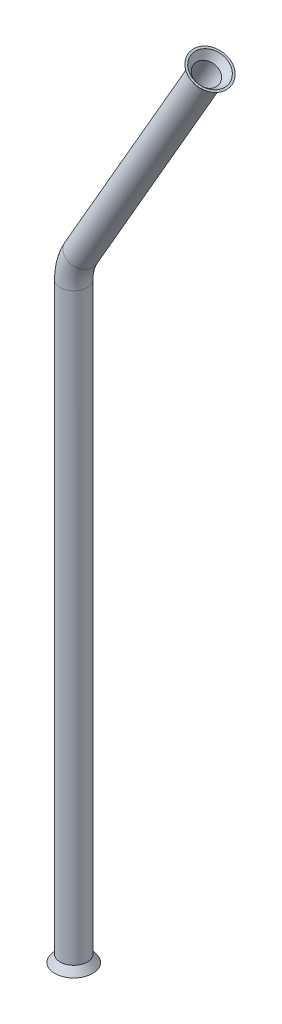
ISO-10303-21;
HEADER;
FILE_DESCRIPTION(('STEP AP214'),'2;1');
FILE_NAME('part.step','',(''),(''),'','','');
FILE_SCHEMA(('AUTOMOTIVE_DESIGN { 1 0 10303 214 1 1 1 1 }'));
ENDSEC;
DATA;
#1=APPLICATION_CONTEXT('core data for automotive mechanical design processes');
#2=APPLICATION_PROTOCOL_DEFINITION('international standard','automotive_design',2000,#1);
#3=PRODUCT_CONTEXT('',#1,'mechanical');
#4=PRODUCT('Part','Part','',(#3));
#5=PRODUCT_RELATED_PRODUCT_CATEGORY('part','',(#4));
#6=PRODUCT_DEFINITION_FORMATION('','',#4);
#7=PRODUCT_DEFINITION_CONTEXT('part definition',#1,'design');
#8=PRODUCT_DEFINITION('design','',#6,#7);
#9=PRODUCT_DEFINITION_SHAPE('','',#8);
#10=(LENGTH_UNIT() NAMED_UNIT(*) SI_UNIT(.MILLI.,.METRE.));
#11=(NAMED_UNIT(*) PLANE_ANGLE_UNIT() SI_UNIT($,.RADIAN.));
#12=(NAMED_UNIT(*) SI_UNIT($,.STERADIAN.) SOLID_ANGLE_UNIT());
#13=UNCERTAINTY_MEASURE_WITH_UNIT(LENGTH_MEASURE(1.E-05),#10,'distance_accuracy_value','');
#14=(GEOMETRIC_REPRESENTATION_CONTEXT(3) GLOBAL_UNCERTAINTY_ASSIGNED_CONTEXT((#13)) GLOBAL_UNIT_ASSIGNED_CONTEXT((#10,
#11,#12)) REPRESENTATION_CONTEXT('',''));
#15=CARTESIAN_POINT('',(0.,0.,0.));
#16=DIRECTION('',(0.,0.,1.));
#17=DIRECTION('',(1.,0.,0.));
#18=AXIS2_PLACEMENT_3D('',#15,#16,#17);
#19=CARTESIAN_POINT('',(0.,0.,0.));
#20=DIRECTION('',(0.,1.,0.));
#21=DIRECTION('',(0.,0.,1.));
#22=AXIS2_PLACEMENT_3D('',#19,#20,#21);
#23=CYLINDRICAL_SURFACE('',#22,4.826);
#24=CARTESIAN_POINT('',(0.,206.956941603564,0.));
#25=DIRECTION('',(0.,1.,0.));
#26=DIRECTION('',(0.,0.,1.));
#27=AXIS2_PLACEMENT_3D('',#24,#25,#26);
#28=CIRCLE('',#27,4.826);
#29=CARTESIAN_POINT('',(-4.82599999999996,206.956941603564,0.));
#30=VERTEX_POINT('',#29);
#31=EDGE_CURVE('E51',#30,#30,#28,.T.);
#32=ORIENTED_EDGE('',*,*,#31,.F.);
#33=EDGE_LOOP('',(#32));
#34=FACE_BOUND('',#33,.T.);
#35=CARTESIAN_POINT('',(0.,0.,0.));
#36=DIRECTION('',(0.,-1.,0.));
#37=DIRECTION('',(0.,0.,-1.));
#38=AXIS2_PLACEMENT_3D('',#35,#36,#37);
#39=CIRCLE('',#38,4.826);
#40=CARTESIAN_POINT('',(0.,0.,-4.826));
#41=VERTEX_POINT('',#40);
#42=EDGE_CURVE('E58',#41,#41,#39,.T.);
#43=ORIENTED_EDGE('',*,*,#42,.F.);
#44=EDGE_LOOP('',(#43));
#45=FACE_BOUND('',#44,.T.);
#46=ADVANCED_FACE('F33',(#34,#45),#23,.T.);
#47=CARTESIAN_POINT('',(19.0500000000001,206.956941603564,0.));
#48=DIRECTION('',(0.,0.,-1.));
#49=DIRECTION('',(-1.,0.,0.));
#50=AXIS2_PLACEMENT_3D('',#47,#48,#49);
#51=TOROIDAL_SURFACE('',#50,19.05,4.826);
#52=CARTESIAN_POINT('',(2.5522160579065,216.481941603564,0.));
#53=DIRECTION('',(0.500000000000001,0.866025403784438,0.));
#54=DIRECTION('',(0.,0.,1.));
#55=AXIS2_PLACEMENT_3D('',#52,#53,#54);
#56=CIRCLE('',#55,4.826);
#57=CARTESIAN_POINT('',(-1.6272225407572,218.894941603564,0.));
#58=VERTEX_POINT('',#57);
#59=EDGE_CURVE('E37',#58,#58,#56,.T.);
#60=CARTESIAN_POINT('',(19.0500000000001,206.956941603564,0.));
#61=DIRECTION('',(0.,0.,-1.));
#62=DIRECTION('',(-1.,0.,0.));
#63=AXIS2_PLACEMENT_3D('',#60,#61,#62);
#64=CIRCLE('',#63,23.876);
#65=EDGE_CURVE('',#30,#58,#64,.T.);
#66=ORIENTED_EDGE('',*,*,#31,.T.);
#67=ORIENTED_EDGE('',*,*,#59,.F.);
#68=ORIENTED_EDGE('',*,*,#65,.T.);
#69=ORIENTED_EDGE('',*,*,#65,.F.);
#70=EDGE_LOOP('',(#66,#68,#67,#69));
#71=FACE_BOUND('',#70,.T.);
#72=ADVANCED_FACE('F99',(#71),#51,.T.);
#73=CARTESIAN_POINT('',(2.55221605790653,216.481941603564,0.));
#74=DIRECTION('',(0.500000000000001,0.866025403784438,0.));
#75=DIRECTION('',(-0.866025403784438,0.500000000000001,0.));
#76=AXIS2_PLACEMENT_3D('',#73,#74,#75);
#77=CYLINDRICAL_SURFACE('',#76,4.826);
#78=CARTESIAN_POINT('',(47.0022160579065,293.4716,0.));
#79=DIRECTION('',(0.500000000000001,0.866025403784438,0.));
#80=DIRECTION('',(0.,0.,1.));
#81=AXIS2_PLACEMENT_3D('',#78,#79,#80);
#82=CIRCLE('',#81,4.826);
#83=CARTESIAN_POINT('',(47.0022160579065,293.4716,4.826));
#84=VERTEX_POINT('',#83);
#85=EDGE_CURVE('E46',#84,#84,#82,.T.);
#86=ORIENTED_EDGE('',*,*,#85,.F.);
#87=EDGE_LOOP('',(#86));
#88=FACE_BOUND('',#87,.T.);
#89=ORIENTED_EDGE('',*,*,#59,.T.);
#90=EDGE_LOOP('',(#89));
#91=FACE_BOUND('',#90,.T.);
#92=ADVANCED_FACE('F35',(#88,#91),#77,.T.);
#93=CARTESIAN_POINT('',(0.,0.,0.));
#94=DIRECTION('',(0.,1.,0.));
#95=DIRECTION('',(0.,0.,1.));
#96=AXIS2_PLACEMENT_3D('',#93,#94,#95);
#97=CYLINDRICAL_SURFACE('',#96,4.064);
#98=CARTESIAN_POINT('',(0.,206.956941603564,0.));
#99=DIRECTION('',(0.,1.,0.));
#100=DIRECTION('',(0.,0.,1.));
#101=AXIS2_PLACEMENT_3D('',#98,#99,#100);
#102=CIRCLE('',#101,4.064);
#103=CARTESIAN_POINT('',(-4.06399999999996,206.956941603564,0.));
#104=VERTEX_POINT('',#103);
#105=EDGE_CURVE('E41',#104,#104,#102,.F.);
#106=ORIENTED_EDGE('',*,*,#105,.F.);
#107=EDGE_LOOP('',(#106));
#108=FACE_BOUND('',#107,.T.);
#109=CARTESIAN_POINT('',(0.,0.,0.));
#110=DIRECTION('',(0.,-1.,0.));
#111=DIRECTION('',(0.,0.,-1.));
#112=AXIS2_PLACEMENT_3D('',#109,#110,#111);
#113=CIRCLE('',#112,4.064);
#114=CARTESIAN_POINT('',(0.,0.,-4.064));
#115=VERTEX_POINT('',#114);
#116=EDGE_CURVE('E62',#115,#115,#113,.T.);
#117=ORIENTED_EDGE('',*,*,#116,.T.);
#118=EDGE_LOOP('',(#117));
#119=FACE_BOUND('',#118,.T.);
#120=ADVANCED_FACE('F98',(#108,#119),#97,.F.);
#121=CARTESIAN_POINT('',(19.0500000000001,206.956941603564,0.));
#122=DIRECTION('',(0.,0.,-1.));
#123=DIRECTION('',(-1.,0.,0.));
#124=AXIS2_PLACEMENT_3D('',#121,#122,#123);
#125=TOROIDAL_SURFACE('',#124,19.05,4.064);
#126=CARTESIAN_POINT('',(2.5522160579065,216.481941603564,0.));
#127=DIRECTION('',(0.500000000000001,0.866025403784438,0.));
#128=DIRECTION('',(0.,0.,1.));
#129=AXIS2_PLACEMENT_3D('',#126,#127,#128);
#130=CIRCLE('',#129,4.064);
#131=CARTESIAN_POINT('',(-0.967311183073461,218.513941603564,0.));
#132=VERTEX_POINT('',#131);
#133=EDGE_CURVE('E10',#132,#132,#130,.F.);
#134=CARTESIAN_POINT('',(19.0500000000001,206.956941603564,0.));
#135=DIRECTION('',(0.,0.,-1.));
#136=DIRECTION('',(-1.,0.,0.));
#137=AXIS2_PLACEMENT_3D('',#134,#135,#136);
#138=CIRCLE('',#137,23.114);
#139=EDGE_CURVE('',#104,#132,#138,.T.);
#140=ORIENTED_EDGE('',*,*,#105,.T.);
#141=ORIENTED_EDGE('',*,*,#133,.F.);
#142=ORIENTED_EDGE('',*,*,#139,.T.);
#143=ORIENTED_EDGE('',*,*,#139,.F.);
#144=EDGE_LOOP('',(#140,#142,#141,#143));
#145=FACE_BOUND('',#144,.T.);
#146=ADVANCED_FACE('F111',(#145),#125,.F.);
#147=CARTESIAN_POINT('',(2.55221605790653,216.481941603564,0.));
#148=DIRECTION('',(0.500000000000001,0.866025403784438,0.));
#149=DIRECTION('',(-0.866025403784438,0.500000000000001,0.));
#150=AXIS2_PLACEMENT_3D('',#147,#148,#149);
#151=CYLINDRICAL_SURFACE('',#150,4.064);
#152=CARTESIAN_POINT('',(47.0022160579064,293.4716,0.));
#153=DIRECTION('',(0.500000000000001,0.866025403784438,0.));
#154=DIRECTION('',(-0.866025403784438,0.500000000000001,0.));
#155=AXIS2_PLACEMENT_3D('',#152,#153,#154);
#156=CIRCLE('',#155,4.06399999999984);
#157=CARTESIAN_POINT('',(43.4826888169266,295.5036,0.));
#158=VERTEX_POINT('',#157);
#159=EDGE_CURVE('E73',#158,#158,#156,.T.);
#160=ORIENTED_EDGE('',*,*,#159,.T.);
#161=EDGE_LOOP('',(#160));
#162=FACE_BOUND('',#161,.T.);
#163=ORIENTED_EDGE('',*,*,#133,.T.);
#164=EDGE_LOOP('',(#163));
#165=FACE_BOUND('',#164,.T.);
#166=ADVANCED_FACE('F109',(#162,#165),#151,.F.);
#167=CARTESIAN_POINT('',(0.,0.,0.));
#168=DIRECTION('',(0.,-1.,0.));
#169=DIRECTION('',(0.,0.,-1.));
#170=AXIS2_PLACEMENT_3D('',#167,#168,#169);
#171=CONICAL_SURFACE('',#170,4.826,0.645771823237903);
#172=CARTESIAN_POINT('',(0.,-2.54,0.));
#173=DIRECTION('',(0.,-1.,0.));
#174=DIRECTION('',(0.,0.,-1.));
#175=AXIS2_PLACEMENT_3D('',#172,#173,#174);
#176=CIRCLE('',#175,6.7400272872611);
#177=CARTESIAN_POINT('',(0.,-2.54,-6.7400272872611));
#178=VERTEX_POINT('',#177);
#179=EDGE_CURVE('E53',#178,#178,#176,.T.);
#180=ORIENTED_EDGE('',*,*,#179,.F.);
#181=EDGE_LOOP('',(#180));
#182=FACE_BOUND('',#181,.T.);
#183=ORIENTED_EDGE('',*,*,#42,.T.);
#184=EDGE_LOOP('',(#183));
#185=FACE_BOUND('',#184,.T.);
#186=ADVANCED_FACE('F108',(#182,#185),#171,.T.);
#187=CARTESIAN_POINT('',(0.,-2.54,0.));
#188=DIRECTION('',(0.,-1.,0.));
#189=DIRECTION('',(0.,0.,-1.));
#190=AXIS2_PLACEMENT_3D('',#187,#188,#189);
#191=PLANE('',#190);
#192=CARTESIAN_POINT('',(0.,-2.54,0.));
#193=DIRECTION('',(0.,-1.,0.));
#194=DIRECTION('',(0.,0.,-1.));
#195=AXIS2_PLACEMENT_3D('',#192,#193,#194);
#196=CIRCLE('',#195,5.9780272872611);
#197=CARTESIAN_POINT('',(0.,-2.54,-5.9780272872611));
#198=VERTEX_POINT('',#197);
#199=EDGE_CURVE('E67',#198,#198,#196,.T.);
#200=ORIENTED_EDGE('',*,*,#199,.F.);
#201=EDGE_LOOP('',(#200));
#202=FACE_BOUND('',#201,.T.);
#203=ORIENTED_EDGE('',*,*,#179,.T.);
#204=EDGE_LOOP('',(#203));
#205=FACE_BOUND('',#204,.T.);
#206=ADVANCED_FACE('F118',(#202,#205),#191,.T.);
#207=CARTESIAN_POINT('',(0.,-2.54,0.));
#208=DIRECTION('',(0.,-1.,0.));
#209=DIRECTION('',(0.,0.,-1.));
#210=AXIS2_PLACEMENT_3D('',#207,#208,#209);
#211=CONICAL_SURFACE('',#210,5.9780272872611,0.645771823237903);
#212=ORIENTED_EDGE('',*,*,#199,.T.);
#213=EDGE_LOOP('',(#212));
#214=FACE_BOUND('',#213,.T.);
#215=ORIENTED_EDGE('',*,*,#116,.F.);
#216=EDGE_LOOP('',(#215));
#217=FACE_BOUND('',#216,.T.);
#218=ADVANCED_FACE('F92',(#214,#217),#211,.F.);
#219=CARTESIAN_POINT('',(47.0022160579065,293.4716,0.));
#220=DIRECTION('',(0.500000000000001,0.866025403784438,0.));
#221=DIRECTION('',(-0.866025403784438,0.500000000000001,0.));
#222=AXIS2_PLACEMENT_3D('',#219,#220,#221);
#223=CONICAL_SURFACE('',#222,4.826,0.645771823237903);
#224=CARTESIAN_POINT('',(48.2722160579065,295.671304525613,0.));
#225=DIRECTION('',(0.500000000000001,0.866025403784438,0.));
#226=DIRECTION('',(-0.866025403784438,0.500000000000001,0.));
#227=AXIS2_PLACEMENT_3D('',#224,#225,#226);
#228=CIRCLE('',#227,6.7400272872611);
#229=CARTESIAN_POINT('',(42.435181204938,299.041318169243,0.));
#230=VERTEX_POINT('',#229);
#231=EDGE_CURVE('E70',#230,#230,#228,.T.);
#232=ORIENTED_EDGE('',*,*,#231,.F.);
#233=EDGE_LOOP('',(#232));
#234=FACE_BOUND('',#233,.T.);
#235=ORIENTED_EDGE('',*,*,#85,.T.);
#236=EDGE_LOOP('',(#235));
#237=FACE_BOUND('',#236,.T.);
#238=ADVANCED_FACE('F86',(#234,#237),#223,.T.);
#239=CARTESIAN_POINT('',(48.2722160579065,295.671304525613,0.));
#240=DIRECTION('',(0.500000000000001,0.866025403784438,0.));
#241=DIRECTION('',(-0.866025403784438,0.500000000000001,0.));
#242=AXIS2_PLACEMENT_3D('',#239,#240,#241);
#243=PLANE('',#242);
#244=CARTESIAN_POINT('',(48.2722160579065,295.671304525613,0.));
#245=DIRECTION('',(0.500000000000001,0.866025403784438,0.));
#246=DIRECTION('',(-0.866025403784438,0.500000000000001,0.));
#247=AXIS2_PLACEMENT_3D('',#244,#245,#246);
#248=CIRCLE('',#247,5.97802728726111);
#249=CARTESIAN_POINT('',(43.0950925626219,298.660318169243,0.));
#250=VERTEX_POINT('',#249);
#251=EDGE_CURVE('E76',#250,#250,#248,.T.);
#252=ORIENTED_EDGE('',*,*,#251,.F.);
#253=EDGE_LOOP('',(#252));
#254=FACE_BOUND('',#253,.T.);
#255=ORIENTED_EDGE('',*,*,#231,.T.);
#256=EDGE_LOOP('',(#255));
#257=FACE_BOUND('',#256,.T.);
#258=ADVANCED_FACE('F83',(#254,#257),#243,.T.);
#259=CARTESIAN_POINT('',(48.2722160579065,295.671304525613,0.));
#260=DIRECTION('',(0.500000000000001,0.866025403784438,0.));
#261=DIRECTION('',(-0.866025403784438,0.500000000000001,0.));
#262=AXIS2_PLACEMENT_3D('',#259,#260,#261);
#263=CONICAL_SURFACE('',#262,5.97802728726111,0.645771823237903);
#264=CARTESIAN_POINT('',(43.0950925626219,298.660318169243,0.));
#265=CARTESIAN_POINT('',(43.0991300236042,298.627435688314,0.));
#266=CARTESIAN_POINT('',(43.1031674845865,298.594553207384,0.));
#267=CARTESIAN_POINT('',(43.1112424065512,298.528788245525,0.));
#268=CARTESIAN_POINT('',(43.1152798675336,298.495905764595,0.));
#269=CARTESIAN_POINT('',(43.1233547894983,298.430140802736,0.));
#270=CARTESIAN_POINT('',(43.1273922504806,298.397258321806,0.));
#271=CARTESIAN_POINT('',(43.1354671724453,298.331493359947,0.));
#272=CARTESIAN_POINT('',(43.1395046334276,298.298610879018,0.));
#273=CARTESIAN_POINT('',(43.1475795553923,298.232845917158,0.));
#274=CARTESIAN_POINT('',(43.1516170163746,298.199963436229,0.));
#275=CARTESIAN_POINT('',(43.1596919383393,298.134198474369,0.));
#276=CARTESIAN_POINT('',(43.1637293993217,298.10131599344,0.));
#277=CARTESIAN_POINT('',(43.1718043212863,298.035551031581,0.));
#278=CARTESIAN_POINT('',(43.1758417822687,298.002668550651,0.));
#279=CARTESIAN_POINT('',(43.1839167042334,297.936903588792,0.));
#280=CARTESIAN_POINT('',(43.1879541652157,297.904021107862,0.));
#281=CARTESIAN_POINT('',(43.1960290871804,297.838256146003,0.));
#282=CARTESIAN_POINT('',(43.2000665481627,297.805373665073,0.));
#283=CARTESIAN_POINT('',(43.2081414701274,297.739608703214,0.));
#284=CARTESIAN_POINT('',(43.2121789311098,297.706726222284,0.));
#285=CARTESIAN_POINT('',(43.2202538530744,297.640961260425,0.));
#286=CARTESIAN_POINT('',(43.2242913140568,297.608078779496,0.));
#287=CARTESIAN_POINT('',(43.2323662360215,297.542313817636,0.));
#288=CARTESIAN_POINT('',(43.2364036970038,297.509431336707,0.));
#289=CARTESIAN_POINT('',(43.2444786189685,297.443666374848,0.));
#290=CARTESIAN_POINT('',(43.2485160799508,297.410783893918,0.));
#291=CARTESIAN_POINT('',(43.2565910019155,297.345018932059,0.));
#292=CARTESIAN_POINT('',(43.2606284628979,297.312136451129,0.));
#293=CARTESIAN_POINT('',(43.2687033848625,297.24637148927,0.));
#294=CARTESIAN_POINT('',(43.2727408458449,297.21348900834,0.));
#295=CARTESIAN_POINT('',(43.2808157678095,297.147724046481,0.));
#296=CARTESIAN_POINT('',(43.2848532287919,297.114841565551,0.));
#297=CARTESIAN_POINT('',(43.2929281507566,297.049076603692,0.));
#298=CARTESIAN_POINT('',(43.2969656117389,297.016194122762,0.));
#299=CARTESIAN_POINT('',(43.3050405337036,296.950429160903,0.));
#300=CARTESIAN_POINT('',(43.3090779946859,296.917546679974,0.));
#301=CARTESIAN_POINT('',(43.3171529166506,296.851781718114,0.));
#302=CARTESIAN_POINT('',(43.321190377633,296.818899237185,0.));
#303=CARTESIAN_POINT('',(43.3292652995977,296.753134275325,0.));
#304=CARTESIAN_POINT('',(43.33330276058,296.720251794396,0.));
#305=CARTESIAN_POINT('',(43.3413776825447,296.654486832537,0.));
#306=CARTESIAN_POINT('',(43.345415143527,296.621604351607,0.));
#307=CARTESIAN_POINT('',(43.3534900654917,296.555839389748,0.));
#308=CARTESIAN_POINT('',(43.357527526474,296.522956908818,0.));
#309=CARTESIAN_POINT('',(43.3656024484387,296.457191946959,0.));
#310=CARTESIAN_POINT('',(43.3696399094211,296.424309466029,0.));
#311=CARTESIAN_POINT('',(43.3777148313858,296.35854450417,0.));
#312=CARTESIAN_POINT('',(43.3817522923681,296.32566202324,0.));
#313=CARTESIAN_POINT('',(43.3898272143328,296.259897061381,0.));
#314=CARTESIAN_POINT('',(43.3938646753151,296.227014580452,0.));
#315=CARTESIAN_POINT('',(43.4019395972798,296.161249618592,0.));
#316=CARTESIAN_POINT('',(43.4059770582621,296.128367137663,0.));
#317=CARTESIAN_POINT('',(43.4140519802268,296.062602175803,0.));
#318=CARTESIAN_POINT('',(43.4180894412092,296.029719694874,0.));
#319=CARTESIAN_POINT('',(43.4261643631738,295.963954733015,0.));
#320=CARTESIAN_POINT('',(43.4302018241562,295.931072252085,0.));
#321=CARTESIAN_POINT('',(43.4382767461209,295.865307290226,0.));
#322=CARTESIAN_POINT('',(43.4423142071032,295.832424809296,0.));
#323=CARTESIAN_POINT('',(43.4503891290679,295.766659847437,0.));
#324=CARTESIAN_POINT('',(43.4544265900502,295.733777366507,0.));
#325=CARTESIAN_POINT('',(43.4625015120149,295.668012404648,0.));
#326=CARTESIAN_POINT('',(43.4665389729973,295.635129923718,0.));
#327=CARTESIAN_POINT('',(43.474613894962,295.569364961859,0.));
#328=CARTESIAN_POINT('',(43.4786513559443,295.53648248093,0.));
#329=CARTESIAN_POINT('',(43.4826888169266,295.5036,0.));
#330=B_SPLINE_CURVE_WITH_KNOTS('',3,(#264,#265,#266,#267,#268,#269,#270,#271,#272,#273,#274,
#275,#276,#277,#278,#279,#280,#281,#282,#283,#284,#285,#286,#287,#288,#289,#290,#291,#292,#293,
#294,#295,#296,#297,#298,#299,#300,#301,#302,#303,#304,#305,#306,#307,#308,#309,#310,#311,#312,
#313,#314,#315,#316,#317,#318,#319,#320,#321,#322,#323,#324,#325,#326,#327,#328,#329),
.UNSPECIFIED.,.F.,.F.,(4,2,2,2,2,2,2,2,2,2,2,2,2,2,2,2,2,2,2,2,2,2,2,2,2,2,2,2,2,2,2,2,4),(0.,
0.0993882678662301,0.198776535732349,0.298164803598523,0.397553071464698,0.496941339330873,
0.596329607196992,0.69571787506322,0.795106142929339,0.894494410795459,0.993882678661689,
1.09327094652781,1.19265921439398,1.2920474822601,1.39143575012633,1.49082401799245,
1.59021228585857,1.6896005537248,1.78898882159092,1.88837708945709,1.98776535732327,
2.08715362518944,2.18654189305556,2.28593016092174,2.38531842878791,2.48470669665403,
2.58409496452026,2.68348323238638,2.78287150025255,2.88225976811873,2.9816480359849,
3.08103630385102,3.18042457171719),.UNSPECIFIED.);
#331=EDGE_CURVE('BSEAM80',#250,#158,#330,.T.);
#332=ORIENTED_EDGE('',*,*,#251,.T.);
#333=ORIENTED_EDGE('',*,*,#159,.F.);
#334=ORIENTED_EDGE('',*,*,#331,.T.);
#335=ORIENTED_EDGE('',*,*,#331,.F.);
#336=EDGE_LOOP('',(#332,#334,#333,#335));
#337=FACE_BOUND('',#336,.T.);
#338=ADVANCED_FACE('F80',(#337),#263,.F.);
#339=CLOSED_SHELL('',(#46,#72,#92,#120,#146,#166,#186,#206,#218,#238,#258,#338));
#340=MANIFOLD_SOLID_BREP('B2',#339);
#341=ADVANCED_BREP_SHAPE_REPRESENTATION('',(#18,#340),#14);
#342=SHAPE_DEFINITION_REPRESENTATION(#9,#341);
ENDSEC;
END-ISO-10303-21;
